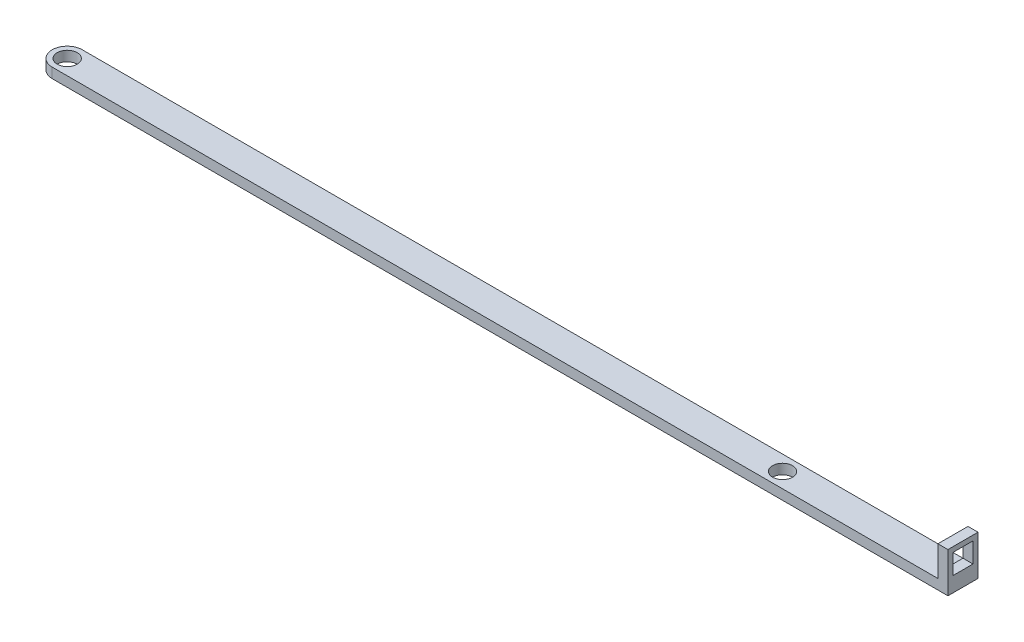
ISO-10303-21;
HEADER;
FILE_DESCRIPTION(('STEP AP214'),'2;1');
FILE_NAME('part.step','',(''),(''),'','','');
FILE_SCHEMA(('AUTOMOTIVE_DESIGN { 1 0 10303 214 1 1 1 1 }'));
ENDSEC;
DATA;
#1=APPLICATION_CONTEXT('core data for automotive mechanical design processes');
#2=APPLICATION_PROTOCOL_DEFINITION('international standard','automotive_design',2000,#1);
#3=PRODUCT_CONTEXT('',#1,'mechanical');
#4=PRODUCT('Part','Part','',(#3));
#5=PRODUCT_RELATED_PRODUCT_CATEGORY('part','',(#4));
#6=PRODUCT_DEFINITION_FORMATION('','',#4);
#7=PRODUCT_DEFINITION_CONTEXT('part definition',#1,'design');
#8=PRODUCT_DEFINITION('design','',#6,#7);
#9=PRODUCT_DEFINITION_SHAPE('','',#8);
#10=(LENGTH_UNIT() NAMED_UNIT(*) SI_UNIT(.MILLI.,.METRE.));
#11=(NAMED_UNIT(*) PLANE_ANGLE_UNIT() SI_UNIT($,.RADIAN.));
#12=(NAMED_UNIT(*) SI_UNIT($,.STERADIAN.) SOLID_ANGLE_UNIT());
#13=UNCERTAINTY_MEASURE_WITH_UNIT(LENGTH_MEASURE(1.E-05),#10,'distance_accuracy_value','');
#14=(GEOMETRIC_REPRESENTATION_CONTEXT(3) GLOBAL_UNCERTAINTY_ASSIGNED_CONTEXT((#13)) GLOBAL_UNIT_ASSIGNED_CONTEXT((#10,
#11,#12)) REPRESENTATION_CONTEXT('',''));
#15=CARTESIAN_POINT('',(0.,0.,0.));
#16=DIRECTION('',(0.,0.,1.));
#17=DIRECTION('',(1.,0.,0.));
#18=AXIS2_PLACEMENT_3D('',#15,#16,#17);
#19=CARTESIAN_POINT('',(0.,6.35,0.));
#20=DIRECTION('',(0.,1.,0.));
#21=DIRECTION('',(0.,0.,1.));
#22=AXIS2_PLACEMENT_3D('',#19,#20,#21);
#23=PLANE('',#22);
#24=DIRECTION('',(0.,0.,1.));
#25=VECTOR('',#24,1.);
#26=CARTESIAN_POINT('',(-6.35000000000004,6.35,-9.525));
#27=LINE('',#26,#25);
#28=CARTESIAN_POINT('',(-6.35000000000006,6.35,-9.525));
#29=VERTEX_POINT('',#28);
#30=CARTESIAN_POINT('',(-6.35000000000008,6.35,9.52500000000007));
#31=VERTEX_POINT('',#30);
#32=EDGE_CURVE('E152',#29,#31,#27,.T.);
#33=ORIENTED_EDGE('',*,*,#32,.F.);
#34=DIRECTION('',(-1.,0.,0.));
#35=VECTOR('',#34,1.);
#36=CARTESIAN_POINT('',(0.,6.35,-9.525));
#37=LINE('',#36,#35);
#38=CARTESIAN_POINT('',(-567.5074248,6.35,-9.52499999999993));
#39=VERTEX_POINT('',#38);
#40=EDGE_CURVE('E203',#29,#39,#37,.T.);
#41=ORIENTED_EDGE('',*,*,#40,.T.);
#42=CARTESIAN_POINT('',(-567.5074248,6.35,0.));
#43=DIRECTION('',(0.,1.,0.));
#44=DIRECTION('',(0.,0.,1.));
#45=AXIS2_PLACEMENT_3D('',#42,#43,#44);
#46=CIRCLE('',#45,9.525);
#47=CARTESIAN_POINT('',(-567.5074248,6.35,9.52500000000007));
#48=VERTEX_POINT('',#47);
#49=EDGE_CURVE('E206',#39,#48,#46,.T.);
#50=ORIENTED_EDGE('',*,*,#49,.T.);
#51=DIRECTION('',(1.,0.,0.));
#52=VECTOR('',#51,1.);
#53=CARTESIAN_POINT('',(0.,6.35,9.525));
#54=LINE('',#53,#52);
#55=EDGE_CURVE('E210',#48,#31,#54,.T.);
#56=ORIENTED_EDGE('',*,*,#55,.T.);
#57=EDGE_LOOP('',(#33,#41,#50,#56));
#58=FACE_BOUND('',#57,.T.);
#59=CARTESIAN_POINT('',(-114.3,6.35,0.));
#60=DIRECTION('',(0.,1.,0.));
#61=DIRECTION('',(0.,0.,1.));
#62=AXIS2_PLACEMENT_3D('',#59,#60,#61);
#63=CIRCLE('',#62,6.35);
#64=CARTESIAN_POINT('',(-114.3,6.35,6.34999999999998));
#65=VERTEX_POINT('',#64);
#66=EDGE_CURVE('E186',#65,#65,#63,.T.);
#67=ORIENTED_EDGE('',*,*,#66,.F.);
#68=EDGE_LOOP('',(#67));
#69=FACE_BOUND('',#68,.T.);
#70=CARTESIAN_POINT('',(-567.5074248,6.35,0.));
#71=DIRECTION('',(0.,1.,0.));
#72=DIRECTION('',(0.,0.,1.));
#73=AXIS2_PLACEMENT_3D('',#70,#71,#72);
#74=CIRCLE('',#73,6.34999999999994);
#75=CARTESIAN_POINT('',(-567.5074248,6.35,6.35000000000001));
#76=VERTEX_POINT('',#75);
#77=EDGE_CURVE('E195',#76,#76,#74,.T.);
#78=ORIENTED_EDGE('',*,*,#77,.F.);
#79=EDGE_LOOP('',(#78));
#80=FACE_BOUND('',#79,.T.);
#81=ADVANCED_FACE('F43',(#58,#69,#80),#23,.T.);
#82=CARTESIAN_POINT('',(0.,0.,0.));
#83=DIRECTION('',(0.,1.,0.));
#84=DIRECTION('',(0.,0.,1.));
#85=AXIS2_PLACEMENT_3D('',#82,#83,#84);
#86=PLANE('',#85);
#87=CARTESIAN_POINT('',(-114.3,0.,0.));
#88=DIRECTION('',(0.,1.,0.));
#89=DIRECTION('',(0.,0.,1.));
#90=AXIS2_PLACEMENT_3D('',#87,#88,#89);
#91=CIRCLE('',#90,6.35);
#92=CARTESIAN_POINT('',(-114.3,0.,6.34999999999998));
#93=VERTEX_POINT('',#92);
#94=EDGE_CURVE('E187',#93,#93,#91,.T.);
#95=ORIENTED_EDGE('',*,*,#94,.T.);
#96=EDGE_LOOP('',(#95));
#97=FACE_BOUND('',#96,.T.);
#98=DIRECTION('',(-1.,0.,0.));
#99=VECTOR('',#98,1.);
#100=CARTESIAN_POINT('',(0.,0.,-9.525));
#101=LINE('',#100,#99);
#102=CARTESIAN_POINT('',(0.,0.,-9.525));
#103=VERTEX_POINT('',#102);
#104=CARTESIAN_POINT('',(-567.5074248,0.,-9.52499999999993));
#105=VERTEX_POINT('',#104);
#106=EDGE_CURVE('E199',#103,#105,#101,.T.);
#107=ORIENTED_EDGE('',*,*,#106,.F.);
#108=DIRECTION('',(0.,0.,1.));
#109=VECTOR('',#108,1.);
#110=CARTESIAN_POINT('',(0.,0.,9.525));
#111=LINE('',#110,#109);
#112=CARTESIAN_POINT('',(0.,0.,9.525));
#113=VERTEX_POINT('',#112);
#114=EDGE_CURVE('E182',#103,#113,#111,.T.);
#115=ORIENTED_EDGE('',*,*,#114,.T.);
#116=DIRECTION('',(1.,0.,0.));
#117=VECTOR('',#116,1.);
#118=CARTESIAN_POINT('',(0.,0.,9.525));
#119=LINE('',#118,#117);
#120=CARTESIAN_POINT('',(-567.5074248,0.,9.52500000000007));
#121=VERTEX_POINT('',#120);
#122=EDGE_CURVE('E207',#121,#113,#119,.T.);
#123=ORIENTED_EDGE('',*,*,#122,.F.);
#124=CARTESIAN_POINT('',(-567.5074248,0.,0.));
#125=DIRECTION('',(0.,1.,0.));
#126=DIRECTION('',(0.,0.,1.));
#127=AXIS2_PLACEMENT_3D('',#124,#125,#126);
#128=CIRCLE('',#127,9.525);
#129=EDGE_CURVE('E216',#105,#121,#128,.T.);
#130=ORIENTED_EDGE('',*,*,#129,.F.);
#131=EDGE_LOOP('',(#107,#115,#123,#130));
#132=FACE_BOUND('',#131,.T.);
#133=CARTESIAN_POINT('',(-567.5074248,0.,0.));
#134=DIRECTION('',(0.,1.,0.));
#135=DIRECTION('',(0.,0.,1.));
#136=AXIS2_PLACEMENT_3D('',#133,#134,#135);
#137=CIRCLE('',#136,6.34999999999994);
#138=CARTESIAN_POINT('',(-567.5074248,0.,6.35000000000001));
#139=VERTEX_POINT('',#138);
#140=EDGE_CURVE('E191',#139,#139,#137,.T.);
#141=ORIENTED_EDGE('',*,*,#140,.T.);
#142=EDGE_LOOP('',(#141));
#143=FACE_BOUND('',#142,.T.);
#144=ADVANCED_FACE('F261',(#97,#132,#143),#86,.F.);
#145=CARTESIAN_POINT('',(0.,6.35,-9.525));
#146=DIRECTION('',(0.,0.,1.));
#147=DIRECTION('',(1.,0.,0.));
#148=AXIS2_PLACEMENT_3D('',#145,#146,#147);
#149=PLANE('',#148);
#150=ORIENTED_EDGE('',*,*,#106,.T.);
#151=DIRECTION('',(0.,-1.,0.));
#152=VECTOR('',#151,1.);
#153=CARTESIAN_POINT('',(-567.5074248,6.35,-9.52499999999993));
#154=LINE('',#153,#152);
#155=EDGE_CURVE('E228',#39,#105,#154,.T.);
#156=ORIENTED_EDGE('',*,*,#155,.F.);
#157=ORIENTED_EDGE('',*,*,#40,.F.);
#158=DIRECTION('',(0.,-1.,0.));
#159=VECTOR('',#158,1.);
#160=CARTESIAN_POINT('',(-6.35000000000004,25.4,-9.525));
#161=LINE('',#160,#159);
#162=CARTESIAN_POINT('',(-6.35000000000004,25.4,-9.525));
#163=VERTEX_POINT('',#162);
#164=EDGE_CURVE('E178',#163,#29,#161,.T.);
#165=ORIENTED_EDGE('',*,*,#164,.F.);
#166=DIRECTION('',(-1.,0.,0.));
#167=VECTOR('',#166,1.);
#168=CARTESIAN_POINT('',(0.,25.4,-9.525));
#169=LINE('',#168,#167);
#170=CARTESIAN_POINT('',(0.,25.4,-9.525));
#171=VERTEX_POINT('',#170);
#172=EDGE_CURVE('E161',#171,#163,#169,.T.);
#173=ORIENTED_EDGE('',*,*,#172,.F.);
#174=DIRECTION('',(0.,-1.,0.));
#175=VECTOR('',#174,1.);
#176=CARTESIAN_POINT('',(0.,6.35,-9.525));
#177=LINE('',#176,#175);
#178=EDGE_CURVE('E232',#171,#103,#177,.T.);
#179=ORIENTED_EDGE('',*,*,#178,.T.);
#180=EDGE_LOOP('',(#150,#156,#157,#165,#173,#179));
#181=FACE_BOUND('',#180,.T.);
#182=ADVANCED_FACE('F45',(#181),#149,.F.);
#183=CARTESIAN_POINT('',(-567.5074248,6.35,0.));
#184=DIRECTION('',(0.,-1.,0.));
#185=DIRECTION('',(0.,0.,-1.));
#186=AXIS2_PLACEMENT_3D('',#183,#184,#185);
#187=CYLINDRICAL_SURFACE('',#186,9.525);
#188=ORIENTED_EDGE('',*,*,#129,.T.);
#189=DIRECTION('',(0.,-1.,0.));
#190=VECTOR('',#189,1.);
#191=CARTESIAN_POINT('',(-567.5074248,6.35,9.52500000000007));
#192=LINE('',#191,#190);
#193=EDGE_CURVE('E224',#48,#121,#192,.T.);
#194=ORIENTED_EDGE('',*,*,#193,.F.);
#195=ORIENTED_EDGE('',*,*,#49,.F.);
#196=ORIENTED_EDGE('',*,*,#155,.T.);
#197=EDGE_LOOP('',(#188,#194,#195,#196));
#198=FACE_BOUND('',#197,.T.);
#199=ADVANCED_FACE('F276',(#198),#187,.T.);
#200=CARTESIAN_POINT('',(0.,6.35,9.525));
#201=DIRECTION('',(0.,0.,-1.));
#202=DIRECTION('',(-1.,0.,0.));
#203=AXIS2_PLACEMENT_3D('',#200,#201,#202);
#204=PLANE('',#203);
#205=ORIENTED_EDGE('',*,*,#122,.T.);
#206=DIRECTION('',(0.,-1.,0.));
#207=VECTOR('',#206,1.);
#208=CARTESIAN_POINT('',(0.,6.35,9.525));
#209=LINE('',#208,#207);
#210=CARTESIAN_POINT('',(0.,25.4,9.525));
#211=VERTEX_POINT('',#210);
#212=EDGE_CURVE('E213',#211,#113,#209,.T.);
#213=ORIENTED_EDGE('',*,*,#212,.F.);
#214=DIRECTION('',(1.,0.,0.));
#215=VECTOR('',#214,1.);
#216=CARTESIAN_POINT('',(0.,25.4,9.525));
#217=LINE('',#216,#215);
#218=CARTESIAN_POINT('',(-6.35000000000008,25.4,9.52500000000007));
#219=VERTEX_POINT('',#218);
#220=EDGE_CURVE('E167',#219,#211,#217,.T.);
#221=ORIENTED_EDGE('',*,*,#220,.F.);
#222=DIRECTION('',(0.,-1.,0.));
#223=VECTOR('',#222,1.);
#224=CARTESIAN_POINT('',(-6.35000000000008,25.4,9.52500000000007));
#225=LINE('',#224,#223);
#226=EDGE_CURVE('E171',#219,#31,#225,.T.);
#227=ORIENTED_EDGE('',*,*,#226,.T.);
#228=ORIENTED_EDGE('',*,*,#55,.F.);
#229=ORIENTED_EDGE('',*,*,#193,.T.);
#230=EDGE_LOOP('',(#205,#213,#221,#227,#228,#229));
#231=FACE_BOUND('',#230,.T.);
#232=ADVANCED_FACE('F274',(#231),#204,.F.);
#233=CARTESIAN_POINT('',(-567.5074248,6.35,0.));
#234=DIRECTION('',(0.,-1.,0.));
#235=DIRECTION('',(0.,0.,-1.));
#236=AXIS2_PLACEMENT_3D('',#233,#234,#235);
#237=CYLINDRICAL_SURFACE('',#236,6.34999999999994);
#238=ORIENTED_EDGE('',*,*,#77,.T.);
#239=EDGE_LOOP('',(#238));
#240=FACE_BOUND('',#239,.T.);
#241=ORIENTED_EDGE('',*,*,#140,.F.);
#242=EDGE_LOOP('',(#241));
#243=FACE_BOUND('',#242,.T.);
#244=ADVANCED_FACE('F271',(#240,#243),#237,.F.);
#245=CARTESIAN_POINT('',(-114.3,0.,0.));
#246=DIRECTION('',(0.,1.,0.));
#247=DIRECTION('',(0.,0.,1.));
#248=AXIS2_PLACEMENT_3D('',#245,#246,#247);
#249=CYLINDRICAL_SURFACE('',#248,6.35);
#250=ORIENTED_EDGE('',*,*,#94,.F.);
#251=EDGE_LOOP('',(#250));
#252=FACE_BOUND('',#251,.T.);
#253=ORIENTED_EDGE('',*,*,#66,.T.);
#254=EDGE_LOOP('',(#253));
#255=FACE_BOUND('',#254,.T.);
#256=ADVANCED_FACE('F305',(#252,#255),#249,.F.);
#257=CARTESIAN_POINT('',(0.,0.,9.525));
#258=DIRECTION('',(-1.,0.,0.));
#259=DIRECTION('',(0.,0.,1.));
#260=AXIS2_PLACEMENT_3D('',#257,#258,#259);
#261=PLANE('',#260);
#262=DIRECTION('',(0.,0.,-1.));
#263=VECTOR('',#262,1.);
#264=CARTESIAN_POINT('',(0.,9.525,6.35));
#265=LINE('',#264,#263);
#266=CARTESIAN_POINT('',(0.,9.525,6.35000000000013));
#267=VERTEX_POINT('',#266);
#268=CARTESIAN_POINT('',(0.,9.525,-6.35));
#269=VERTEX_POINT('',#268);
#270=EDGE_CURVE('E134',#267,#269,#265,.T.);
#271=ORIENTED_EDGE('',*,*,#270,.F.);
#272=DIRECTION('',(0.,-1.,0.));
#273=VECTOR('',#272,1.);
#274=CARTESIAN_POINT('',(0.,22.225,6.34999999999999));
#275=LINE('',#274,#273);
#276=CARTESIAN_POINT('',(0.,22.225,6.34999999999999));
#277=VERTEX_POINT('',#276);
#278=EDGE_CURVE('E59',#277,#267,#275,.T.);
#279=ORIENTED_EDGE('',*,*,#278,.F.);
#280=DIRECTION('',(0.,0.,1.));
#281=VECTOR('',#280,1.);
#282=CARTESIAN_POINT('',(0.,22.225,6.34999999999999));
#283=LINE('',#282,#281);
#284=CARTESIAN_POINT('',(0.,22.225,-6.35));
#285=VERTEX_POINT('',#284);
#286=EDGE_CURVE('E142',#285,#277,#283,.T.);
#287=ORIENTED_EDGE('',*,*,#286,.F.);
#288=DIRECTION('',(0.,1.,0.));
#289=VECTOR('',#288,1.);
#290=CARTESIAN_POINT('',(0.,22.225,-6.35));
#291=LINE('',#290,#289);
#292=EDGE_CURVE('E124',#269,#285,#291,.T.);
#293=ORIENTED_EDGE('',*,*,#292,.F.);
#294=EDGE_LOOP('',(#271,#279,#287,#293));
#295=FACE_BOUND('',#294,.T.);
#296=ORIENTED_EDGE('',*,*,#178,.F.);
#297=DIRECTION('',(0.,0.,-1.));
#298=VECTOR('',#297,1.);
#299=CARTESIAN_POINT('',(0.,25.4,-9.525));
#300=LINE('',#299,#298);
#301=EDGE_CURVE('E157',#211,#171,#300,.T.);
#302=ORIENTED_EDGE('',*,*,#301,.F.);
#303=ORIENTED_EDGE('',*,*,#212,.T.);
#304=ORIENTED_EDGE('',*,*,#114,.F.);
#305=EDGE_LOOP('',(#296,#302,#303,#304));
#306=FACE_BOUND('',#305,.T.);
#307=ADVANCED_FACE('F139',(#295,#306),#261,.F.);
#308=CARTESIAN_POINT('',(-6.35000000000004,25.4,-9.525));
#309=DIRECTION('',(1.,0.,0.));
#310=DIRECTION('',(0.,0.,-1.));
#311=AXIS2_PLACEMENT_3D('',#308,#309,#310);
#312=PLANE('',#311);
#313=DIRECTION('',(0.,0.,1.));
#314=VECTOR('',#313,1.);
#315=CARTESIAN_POINT('',(-6.35000000000004,22.225,-9.525));
#316=LINE('',#315,#314);
#317=CARTESIAN_POINT('',(-6.35000000000005,22.225,-6.34999999999996));
#318=VERTEX_POINT('',#317);
#319=CARTESIAN_POINT('',(-6.35000000000006,22.225,6.35000000000004));
#320=VERTEX_POINT('',#319);
#321=EDGE_CURVE('E52',#318,#320,#316,.T.);
#322=ORIENTED_EDGE('',*,*,#321,.T.);
#323=DIRECTION('',(0.,-1.,0.));
#324=VECTOR('',#323,1.);
#325=CARTESIAN_POINT('',(-6.35000000000007,25.4,6.35000000000003));
#326=LINE('',#325,#324);
#327=CARTESIAN_POINT('',(-6.35000000000006,9.525,6.35000000000004));
#328=VERTEX_POINT('',#327);
#329=EDGE_CURVE('E11',#320,#328,#326,.T.);
#330=ORIENTED_EDGE('',*,*,#329,.T.);
#331=DIRECTION('',(0.,0.,-1.));
#332=VECTOR('',#331,1.);
#333=CARTESIAN_POINT('',(-6.35000000000004,9.525,-9.52499999999999));
#334=LINE('',#333,#332);
#335=CARTESIAN_POINT('',(-6.35000000000004,9.525,-6.35));
#336=VERTEX_POINT('',#335);
#337=EDGE_CURVE('E236',#328,#336,#334,.T.);
#338=ORIENTED_EDGE('',*,*,#337,.T.);
#339=DIRECTION('',(0.,1.,0.));
#340=VECTOR('',#339,1.);
#341=CARTESIAN_POINT('',(-6.35000000000004,25.4,-6.34999999999996));
#342=LINE('',#341,#340);
#343=EDGE_CURVE('E127',#336,#318,#342,.T.);
#344=ORIENTED_EDGE('',*,*,#343,.T.);
#345=EDGE_LOOP('',(#322,#330,#338,#344));
#346=FACE_BOUND('',#345,.T.);
#347=ORIENTED_EDGE('',*,*,#32,.T.);
#348=ORIENTED_EDGE('',*,*,#226,.F.);
#349=DIRECTION('',(0.,0.,1.));
#350=VECTOR('',#349,1.);
#351=CARTESIAN_POINT('',(-6.35000000000004,25.4,-9.525));
#352=LINE('',#351,#350);
#353=EDGE_CURVE('E164',#163,#219,#352,.T.);
#354=ORIENTED_EDGE('',*,*,#353,.F.);
#355=ORIENTED_EDGE('',*,*,#164,.T.);
#356=EDGE_LOOP('',(#347,#348,#354,#355));
#357=FACE_BOUND('',#356,.T.);
#358=ADVANCED_FACE('F243',(#346,#357),#312,.F.);
#359=CARTESIAN_POINT('',(0.,25.4,0.));
#360=DIRECTION('',(0.,-1.,0.));
#361=DIRECTION('',(0.,0.,-1.));
#362=AXIS2_PLACEMENT_3D('',#359,#360,#361);
#363=PLANE('',#362);
#364=ORIENTED_EDGE('',*,*,#301,.T.);
#365=ORIENTED_EDGE('',*,*,#172,.T.);
#366=ORIENTED_EDGE('',*,*,#353,.T.);
#367=ORIENTED_EDGE('',*,*,#220,.T.);
#368=EDGE_LOOP('',(#364,#365,#366,#367));
#369=FACE_BOUND('',#368,.T.);
#370=ADVANCED_FACE('F250',(#369),#363,.F.);
#371=CARTESIAN_POINT('',(-19.05,22.225,6.35000000000013));
#372=DIRECTION('',(0.,0.,1.));
#373=DIRECTION('',(1.,0.,0.));
#374=AXIS2_PLACEMENT_3D('',#371,#372,#373);
#375=PLANE('',#374);
#376=DIRECTION('',(1.,0.,0.));
#377=VECTOR('',#376,1.);
#378=CARTESIAN_POINT('',(-19.05,22.225,6.35000000000013));
#379=LINE('',#378,#377);
#380=EDGE_CURVE('E149',#320,#277,#379,.T.);
#381=ORIENTED_EDGE('',*,*,#380,.T.);
#382=ORIENTED_EDGE('',*,*,#278,.T.);
#383=DIRECTION('',(1.,0.,0.));
#384=VECTOR('',#383,1.);
#385=CARTESIAN_POINT('',(-19.05,9.525,6.35000000000013));
#386=LINE('',#385,#384);
#387=EDGE_CURVE('E131',#328,#267,#386,.T.);
#388=ORIENTED_EDGE('',*,*,#387,.F.);
#389=ORIENTED_EDGE('',*,*,#329,.F.);
#390=EDGE_LOOP('',(#381,#382,#388,#389));
#391=FACE_BOUND('',#390,.T.);
#392=ADVANCED_FACE('F248',(#391),#375,.F.);
#393=CARTESIAN_POINT('',(-19.05,22.225,6.35000000000013));
#394=DIRECTION('',(0.,1.,0.));
#395=DIRECTION('',(0.,0.,1.));
#396=AXIS2_PLACEMENT_3D('',#393,#394,#395);
#397=PLANE('',#396);
#398=DIRECTION('',(1.,0.,0.));
#399=VECTOR('',#398,1.);
#400=CARTESIAN_POINT('',(-19.05,22.225,-6.34999999999987));
#401=LINE('',#400,#399);
#402=EDGE_CURVE('E130',#318,#285,#401,.T.);
#403=ORIENTED_EDGE('',*,*,#402,.T.);
#404=ORIENTED_EDGE('',*,*,#286,.T.);
#405=ORIENTED_EDGE('',*,*,#380,.F.);
#406=ORIENTED_EDGE('',*,*,#321,.F.);
#407=EDGE_LOOP('',(#403,#404,#405,#406));
#408=FACE_BOUND('',#407,.T.);
#409=ADVANCED_FACE('F247',(#408),#397,.F.);
#410=CARTESIAN_POINT('',(-19.05,22.225,-6.34999999999987));
#411=DIRECTION('',(0.,0.,-1.));
#412=DIRECTION('',(-1.,0.,0.));
#413=AXIS2_PLACEMENT_3D('',#410,#411,#412);
#414=PLANE('',#413);
#415=DIRECTION('',(1.,0.,0.));
#416=VECTOR('',#415,1.);
#417=CARTESIAN_POINT('',(-19.05,9.525,-6.34999999999987));
#418=LINE('',#417,#416);
#419=EDGE_CURVE('E67',#336,#269,#418,.T.);
#420=ORIENTED_EDGE('',*,*,#419,.T.);
#421=ORIENTED_EDGE('',*,*,#292,.T.);
#422=ORIENTED_EDGE('',*,*,#402,.F.);
#423=ORIENTED_EDGE('',*,*,#343,.F.);
#424=EDGE_LOOP('',(#420,#421,#422,#423));
#425=FACE_BOUND('',#424,.T.);
#426=ADVANCED_FACE('F121',(#425),#414,.F.);
#427=CARTESIAN_POINT('',(-19.05,9.525,6.35000000000013));
#428=DIRECTION('',(0.,-1.,0.));
#429=DIRECTION('',(0.,0.,-1.));
#430=AXIS2_PLACEMENT_3D('',#427,#428,#429);
#431=PLANE('',#430);
#432=ORIENTED_EDGE('',*,*,#387,.T.);
#433=ORIENTED_EDGE('',*,*,#270,.T.);
#434=ORIENTED_EDGE('',*,*,#419,.F.);
#435=ORIENTED_EDGE('',*,*,#337,.F.);
#436=EDGE_LOOP('',(#432,#433,#434,#435));
#437=FACE_BOUND('',#436,.T.);
#438=ADVANCED_FACE('F135',(#437),#431,.F.);
#439=CLOSED_SHELL('',(#81,#144,#182,#199,#232,#244,#256,#307,#358,#370,#392,#409,#426,#438));
#440=MANIFOLD_SOLID_BREP('B2',#439);
#441=ADVANCED_BREP_SHAPE_REPRESENTATION('',(#18,#440),#14);
#442=SHAPE_DEFINITION_REPRESENTATION(#9,#441);
ENDSEC;
END-ISO-10303-21;
